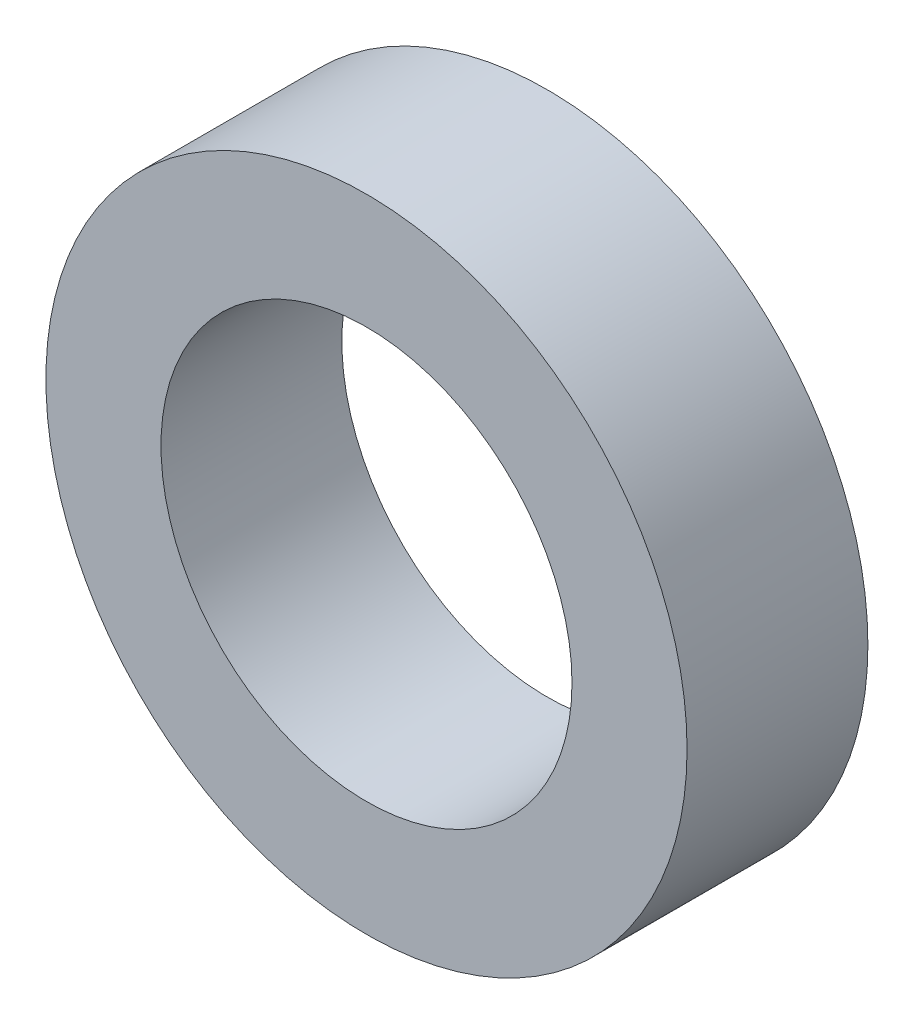
ISO-10303-21;
HEADER;
FILE_DESCRIPTION(('STEP AP214'),'2;1');
FILE_NAME('part.step','',(''),(''),'','','');
FILE_SCHEMA(('AUTOMOTIVE_DESIGN { 1 0 10303 214 1 1 1 1 }'));
ENDSEC;
DATA;
#1=APPLICATION_CONTEXT('core data for automotive mechanical design processes');
#2=APPLICATION_PROTOCOL_DEFINITION('international standard','automotive_design',2000,#1);
#3=PRODUCT_CONTEXT('',#1,'mechanical');
#4=PRODUCT('Part','Part','',(#3));
#5=PRODUCT_RELATED_PRODUCT_CATEGORY('part','',(#4));
#6=PRODUCT_DEFINITION_FORMATION('','',#4);
#7=PRODUCT_DEFINITION_CONTEXT('part definition',#1,'design');
#8=PRODUCT_DEFINITION('design','',#6,#7);
#9=PRODUCT_DEFINITION_SHAPE('','',#8);
#10=(LENGTH_UNIT() NAMED_UNIT(*) SI_UNIT(.MILLI.,.METRE.));
#11=(NAMED_UNIT(*) PLANE_ANGLE_UNIT() SI_UNIT($,.RADIAN.));
#12=(NAMED_UNIT(*) SI_UNIT($,.STERADIAN.) SOLID_ANGLE_UNIT());
#13=UNCERTAINTY_MEASURE_WITH_UNIT(LENGTH_MEASURE(1.E-05),#10,'distance_accuracy_value','');
#14=(GEOMETRIC_REPRESENTATION_CONTEXT(3) GLOBAL_UNCERTAINTY_ASSIGNED_CONTEXT((#13)) GLOBAL_UNIT_ASSIGNED_CONTEXT((#10,
#11,#12)) REPRESENTATION_CONTEXT('',''));
#15=CARTESIAN_POINT('',(0.,0.,0.));
#16=DIRECTION('',(0.,0.,1.));
#17=DIRECTION('',(1.,0.,0.));
#18=AXIS2_PLACEMENT_3D('',#15,#16,#17);
#19=CARTESIAN_POINT('',(0.,0.,22.));
#20=DIRECTION('',(0.,0.,1.));
#21=DIRECTION('',(1.,0.,0.));
#22=AXIS2_PLACEMENT_3D('',#19,#20,#21);
#23=PLANE('',#22);
#24=CARTESIAN_POINT('',(0.,0.,22.));
#25=DIRECTION('',(0.,0.,1.));
#26=DIRECTION('',(1.,0.,0.));
#27=AXIS2_PLACEMENT_3D('',#24,#25,#26);
#28=CIRCLE('',#27,39.);
#29=CARTESIAN_POINT('',(39.,0.,22.));
#30=VERTEX_POINT('',#29);
#31=EDGE_CURVE('E10',#30,#30,#28,.T.);
#32=ORIENTED_EDGE('',*,*,#31,.T.);
#33=EDGE_LOOP('',(#32));
#34=FACE_BOUND('',#33,.T.);
#35=CARTESIAN_POINT('',(0.,0.,22.));
#36=DIRECTION('',(0.,0.,1.));
#37=DIRECTION('',(1.,0.,0.));
#38=AXIS2_PLACEMENT_3D('',#35,#36,#37);
#39=CIRCLE('',#38,25.);
#40=CARTESIAN_POINT('',(25.,0.,22.));
#41=VERTEX_POINT('',#40);
#42=EDGE_CURVE('E45',#41,#41,#39,.T.);
#43=ORIENTED_EDGE('',*,*,#42,.F.);
#44=EDGE_LOOP('',(#43));
#45=FACE_BOUND('',#44,.T.);
#46=ADVANCED_FACE('F34',(#34,#45),#23,.T.);
#47=CARTESIAN_POINT('',(0.,0.,0.));
#48=DIRECTION('',(0.,0.,1.));
#49=DIRECTION('',(1.,0.,0.));
#50=AXIS2_PLACEMENT_3D('',#47,#48,#49);
#51=PLANE('',#50);
#52=CARTESIAN_POINT('',(0.,0.,0.));
#53=DIRECTION('',(0.,0.,1.));
#54=DIRECTION('',(1.,0.,0.));
#55=AXIS2_PLACEMENT_3D('',#52,#53,#54);
#56=CIRCLE('',#55,39.);
#57=CARTESIAN_POINT('',(39.,0.,0.));
#58=VERTEX_POINT('',#57);
#59=EDGE_CURVE('E38',#58,#58,#56,.T.);
#60=ORIENTED_EDGE('',*,*,#59,.F.);
#61=EDGE_LOOP('',(#60));
#62=FACE_BOUND('',#61,.T.);
#63=CARTESIAN_POINT('',(0.,0.,0.));
#64=DIRECTION('',(0.,0.,1.));
#65=DIRECTION('',(1.,0.,0.));
#66=AXIS2_PLACEMENT_3D('',#63,#64,#65);
#67=CIRCLE('',#66,25.);
#68=CARTESIAN_POINT('',(25.,0.,0.));
#69=VERTEX_POINT('',#68);
#70=EDGE_CURVE('E47',#69,#69,#67,.T.);
#71=ORIENTED_EDGE('',*,*,#70,.T.);
#72=EDGE_LOOP('',(#71));
#73=FACE_BOUND('',#72,.T.);
#74=ADVANCED_FACE('F57',(#62,#73),#51,.F.);
#75=CARTESIAN_POINT('',(0.,0.,22.));
#76=DIRECTION('',(0.,0.,-1.));
#77=DIRECTION('',(-1.,0.,0.));
#78=AXIS2_PLACEMENT_3D('',#75,#76,#77);
#79=CYLINDRICAL_SURFACE('',#78,39.);
#80=ORIENTED_EDGE('',*,*,#31,.F.);
#81=EDGE_LOOP('',(#80));
#82=FACE_BOUND('',#81,.T.);
#83=ORIENTED_EDGE('',*,*,#59,.T.);
#84=EDGE_LOOP('',(#83));
#85=FACE_BOUND('',#84,.T.);
#86=ADVANCED_FACE('F36',(#82,#85),#79,.T.);
#87=CARTESIAN_POINT('',(0.,0.,22.));
#88=DIRECTION('',(0.,0.,-1.));
#89=DIRECTION('',(-1.,0.,0.));
#90=AXIS2_PLACEMENT_3D('',#87,#88,#89);
#91=CYLINDRICAL_SURFACE('',#90,25.);
#92=ORIENTED_EDGE('',*,*,#42,.T.);
#93=EDGE_LOOP('',(#92));
#94=FACE_BOUND('',#93,.T.);
#95=ORIENTED_EDGE('',*,*,#70,.F.);
#96=EDGE_LOOP('',(#95));
#97=FACE_BOUND('',#96,.T.);
#98=ADVANCED_FACE('F53',(#94,#97),#91,.F.);
#99=CLOSED_SHELL('',(#46,#74,#86,#98));
#100=MANIFOLD_SOLID_BREP('B2',#99);
#101=ADVANCED_BREP_SHAPE_REPRESENTATION('',(#18,#100),#14);
#102=SHAPE_DEFINITION_REPRESENTATION(#9,#101);
ENDSEC;
END-ISO-10303-21;
